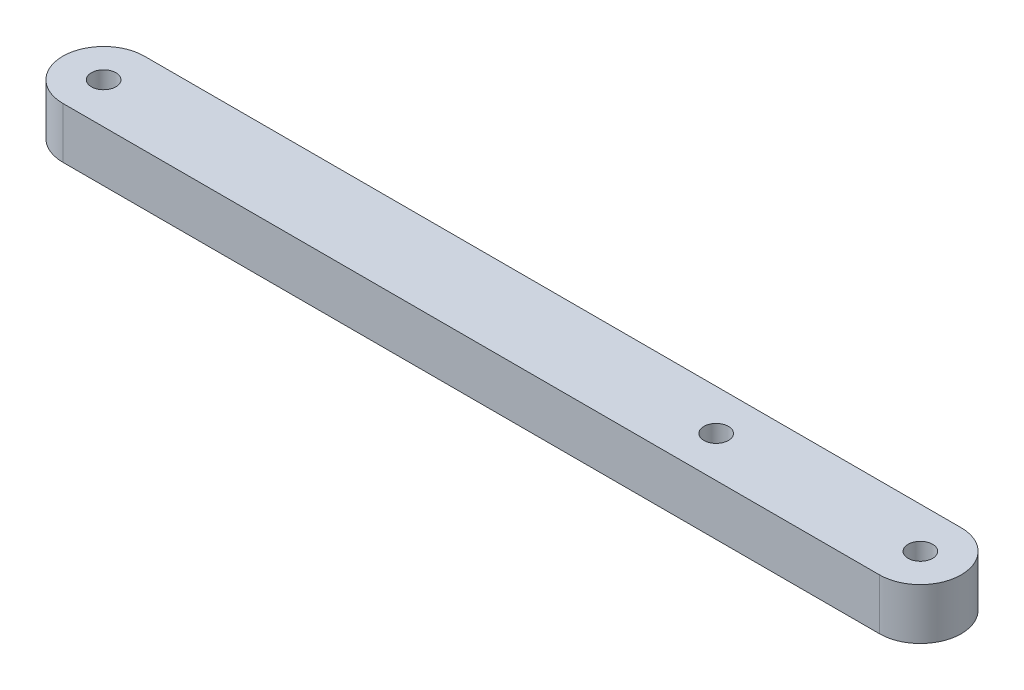
ISO-10303-21;
HEADER;
FILE_DESCRIPTION(('STEP AP214'),'2;1');
FILE_NAME('part.step','',(''),(''),'','','');
FILE_SCHEMA(('AUTOMOTIVE_DESIGN { 1 0 10303 214 1 1 1 1 }'));
ENDSEC;
DATA;
#1=APPLICATION_CONTEXT('core data for automotive mechanical design processes');
#2=APPLICATION_PROTOCOL_DEFINITION('international standard','automotive_design',2000,#1);
#3=PRODUCT_CONTEXT('',#1,'mechanical');
#4=PRODUCT('Part','Part','',(#3));
#5=PRODUCT_RELATED_PRODUCT_CATEGORY('part','',(#4));
#6=PRODUCT_DEFINITION_FORMATION('','',#4);
#7=PRODUCT_DEFINITION_CONTEXT('part definition',#1,'design');
#8=PRODUCT_DEFINITION('design','',#6,#7);
#9=PRODUCT_DEFINITION_SHAPE('','',#8);
#10=(LENGTH_UNIT() NAMED_UNIT(*) SI_UNIT(.MILLI.,.METRE.));
#11=(NAMED_UNIT(*) PLANE_ANGLE_UNIT() SI_UNIT($,.RADIAN.));
#12=(NAMED_UNIT(*) SI_UNIT($,.STERADIAN.) SOLID_ANGLE_UNIT());
#13=UNCERTAINTY_MEASURE_WITH_UNIT(LENGTH_MEASURE(1.E-05),#10,'distance_accuracy_value','');
#14=(GEOMETRIC_REPRESENTATION_CONTEXT(3) GLOBAL_UNCERTAINTY_ASSIGNED_CONTEXT((#13)) GLOBAL_UNIT_ASSIGNED_CONTEXT((#10,
#11,#12)) REPRESENTATION_CONTEXT('',''));
#15=CARTESIAN_POINT('',(0.,0.,0.));
#16=DIRECTION('',(0.,0.,1.));
#17=DIRECTION('',(1.,0.,0.));
#18=AXIS2_PLACEMENT_3D('',#15,#16,#17);
#19=CARTESIAN_POINT('',(0.,25.,0.));
#20=DIRECTION('',(0.,1.,0.));
#21=DIRECTION('',(0.,0.,1.));
#22=AXIS2_PLACEMENT_3D('',#19,#20,#21);
#23=PLANE('',#22);
#24=CARTESIAN_POINT('',(400.,25.,0.));
#25=DIRECTION('',(0.,1.,0.));
#26=DIRECTION('',(0.,0.,1.));
#27=AXIS2_PLACEMENT_3D('',#24,#25,#26);
#28=CIRCLE('',#27,5.99999999999999);
#29=CARTESIAN_POINT('',(400.,25.,5.99999999999999));
#30=VERTEX_POINT('',#29);
#31=EDGE_CURVE('E115',#30,#30,#28,.T.);
#32=ORIENTED_EDGE('',*,*,#31,.F.);
#33=EDGE_LOOP('',(#32));
#34=FACE_BOUND('',#33,.T.);
#35=CARTESIAN_POINT('',(0.,25.,0.));
#36=DIRECTION('',(0.,1.,0.));
#37=DIRECTION('',(0.,0.,1.));
#38=AXIS2_PLACEMENT_3D('',#35,#36,#37);
#39=CIRCLE('',#38,20.);
#40=CARTESIAN_POINT('',(0.,25.,-20.));
#41=VERTEX_POINT('',#40);
#42=CARTESIAN_POINT('',(0.,25.,20.));
#43=VERTEX_POINT('',#42);
#44=EDGE_CURVE('E85',#41,#43,#39,.T.);
#45=ORIENTED_EDGE('',*,*,#44,.T.);
#46=DIRECTION('',(1.,0.,0.));
#47=VECTOR('',#46,1.);
#48=CARTESIAN_POINT('',(0.,25.,20.));
#49=LINE('',#48,#47);
#50=CARTESIAN_POINT('',(400.,25.,20.));
#51=VERTEX_POINT('',#50);
#52=EDGE_CURVE('E80',#43,#51,#49,.T.);
#53=ORIENTED_EDGE('',*,*,#52,.T.);
#54=CARTESIAN_POINT('',(400.,25.,0.));
#55=DIRECTION('',(0.,1.,0.));
#56=DIRECTION('',(0.,0.,1.));
#57=AXIS2_PLACEMENT_3D('',#54,#55,#56);
#58=CIRCLE('',#57,20.);
#59=CARTESIAN_POINT('',(400.,25.,-20.));
#60=VERTEX_POINT('',#59);
#61=EDGE_CURVE('E83',#51,#60,#58,.T.);
#62=ORIENTED_EDGE('',*,*,#61,.T.);
#63=DIRECTION('',(-1.,0.,0.));
#64=VECTOR('',#63,1.);
#65=CARTESIAN_POINT('',(0.,25.,-20.));
#66=LINE('',#65,#64);
#67=EDGE_CURVE('E50',#60,#41,#66,.T.);
#68=ORIENTED_EDGE('',*,*,#67,.T.);
#69=EDGE_LOOP('',(#45,#53,#62,#68));
#70=FACE_BOUND('',#69,.T.);
#71=CARTESIAN_POINT('',(300.,25.,0.));
#72=DIRECTION('',(0.,1.,0.));
#73=DIRECTION('',(0.,0.,1.));
#74=AXIS2_PLACEMENT_3D('',#71,#72,#73);
#75=CIRCLE('',#74,5.99999999999999);
#76=CARTESIAN_POINT('',(300.,25.,5.99999999999999));
#77=VERTEX_POINT('',#76);
#78=EDGE_CURVE('E100',#77,#77,#75,.T.);
#79=ORIENTED_EDGE('',*,*,#78,.F.);
#80=EDGE_LOOP('',(#79));
#81=FACE_BOUND('',#80,.T.);
#82=CARTESIAN_POINT('',(0.,25.,0.));
#83=DIRECTION('',(0.,1.,0.));
#84=DIRECTION('',(0.,0.,1.));
#85=AXIS2_PLACEMENT_3D('',#82,#83,#84);
#86=CIRCLE('',#85,6.);
#87=CARTESIAN_POINT('',(0.,25.,6.));
#88=VERTEX_POINT('',#87);
#89=EDGE_CURVE('E121',#88,#88,#86,.T.);
#90=ORIENTED_EDGE('',*,*,#89,.F.);
#91=EDGE_LOOP('',(#90));
#92=FACE_BOUND('',#91,.T.);
#93=ADVANCED_FACE('F33',(#34,#70,#81,#92),#23,.T.);
#94=CARTESIAN_POINT('',(0.,0.,0.));
#95=DIRECTION('',(0.,1.,0.));
#96=DIRECTION('',(0.,0.,1.));
#97=AXIS2_PLACEMENT_3D('',#94,#95,#96);
#98=PLANE('',#97);
#99=CARTESIAN_POINT('',(0.,0.,0.));
#100=DIRECTION('',(0.,1.,0.));
#101=DIRECTION('',(0.,0.,1.));
#102=AXIS2_PLACEMENT_3D('',#99,#100,#101);
#103=CIRCLE('',#102,20.);
#104=CARTESIAN_POINT('',(0.,0.,-20.));
#105=VERTEX_POINT('',#104);
#106=CARTESIAN_POINT('',(0.,0.,20.));
#107=VERTEX_POINT('',#106);
#108=EDGE_CURVE('E97',#105,#107,#103,.T.);
#109=ORIENTED_EDGE('',*,*,#108,.F.);
#110=DIRECTION('',(-1.,0.,0.));
#111=VECTOR('',#110,1.);
#112=CARTESIAN_POINT('',(0.,0.,-20.));
#113=LINE('',#112,#111);
#114=CARTESIAN_POINT('',(400.,0.,-20.));
#115=VERTEX_POINT('',#114);
#116=EDGE_CURVE('E73',#115,#105,#113,.T.);
#117=ORIENTED_EDGE('',*,*,#116,.F.);
#118=CARTESIAN_POINT('',(400.,0.,0.));
#119=DIRECTION('',(0.,1.,0.));
#120=DIRECTION('',(0.,0.,1.));
#121=AXIS2_PLACEMENT_3D('',#118,#119,#120);
#122=CIRCLE('',#121,20.);
#123=CARTESIAN_POINT('',(400.,0.,20.));
#124=VERTEX_POINT('',#123);
#125=EDGE_CURVE('E67',#124,#115,#122,.T.);
#126=ORIENTED_EDGE('',*,*,#125,.F.);
#127=DIRECTION('',(1.,0.,0.));
#128=VECTOR('',#127,1.);
#129=CARTESIAN_POINT('',(0.,0.,20.));
#130=LINE('',#129,#128);
#131=EDGE_CURVE('E89',#107,#124,#130,.T.);
#132=ORIENTED_EDGE('',*,*,#131,.F.);
#133=EDGE_LOOP('',(#109,#117,#126,#132));
#134=FACE_BOUND('',#133,.T.);
#135=CARTESIAN_POINT('',(300.,0.,0.));
#136=DIRECTION('',(0.,1.,0.));
#137=DIRECTION('',(0.,0.,1.));
#138=AXIS2_PLACEMENT_3D('',#135,#136,#137);
#139=CIRCLE('',#138,5.99999999999999);
#140=CARTESIAN_POINT('',(300.,0.,5.99999999999999));
#141=VERTEX_POINT('',#140);
#142=EDGE_CURVE('E112',#141,#141,#139,.T.);
#143=ORIENTED_EDGE('',*,*,#142,.T.);
#144=EDGE_LOOP('',(#143));
#145=FACE_BOUND('',#144,.T.);
#146=CARTESIAN_POINT('',(400.,0.,0.));
#147=DIRECTION('',(0.,1.,0.));
#148=DIRECTION('',(0.,0.,1.));
#149=AXIS2_PLACEMENT_3D('',#146,#147,#148);
#150=CIRCLE('',#149,5.99999999999999);
#151=CARTESIAN_POINT('',(400.,0.,5.99999999999999));
#152=VERTEX_POINT('',#151);
#153=EDGE_CURVE('E118',#152,#152,#150,.T.);
#154=ORIENTED_EDGE('',*,*,#153,.T.);
#155=EDGE_LOOP('',(#154));
#156=FACE_BOUND('',#155,.T.);
#157=CARTESIAN_POINT('',(0.,0.,0.));
#158=DIRECTION('',(0.,1.,0.));
#159=DIRECTION('',(0.,0.,1.));
#160=AXIS2_PLACEMENT_3D('',#157,#158,#159);
#161=CIRCLE('',#160,6.);
#162=CARTESIAN_POINT('',(0.,0.,6.));
#163=VERTEX_POINT('',#162);
#164=EDGE_CURVE('E124',#163,#163,#161,.T.);
#165=ORIENTED_EDGE('',*,*,#164,.T.);
#166=EDGE_LOOP('',(#165));
#167=FACE_BOUND('',#166,.T.);
#168=ADVANCED_FACE('F108',(#134,#145,#156,#167),#98,.F.);
#169=CARTESIAN_POINT('',(0.,25.,0.));
#170=DIRECTION('',(0.,-1.,0.));
#171=DIRECTION('',(0.,0.,-1.));
#172=AXIS2_PLACEMENT_3D('',#169,#170,#171);
#173=CYLINDRICAL_SURFACE('',#172,20.);
#174=ORIENTED_EDGE('',*,*,#108,.T.);
#175=DIRECTION('',(0.,-1.,0.));
#176=VECTOR('',#175,1.);
#177=CARTESIAN_POINT('',(0.,25.,20.));
#178=LINE('',#177,#176);
#179=EDGE_CURVE('E11',#43,#107,#178,.T.);
#180=ORIENTED_EDGE('',*,*,#179,.F.);
#181=ORIENTED_EDGE('',*,*,#44,.F.);
#182=DIRECTION('',(0.,-1.,0.));
#183=VECTOR('',#182,1.);
#184=CARTESIAN_POINT('',(0.,25.,-20.));
#185=LINE('',#184,#183);
#186=EDGE_CURVE('E93',#41,#105,#185,.T.);
#187=ORIENTED_EDGE('',*,*,#186,.T.);
#188=EDGE_LOOP('',(#174,#180,#181,#187));
#189=FACE_BOUND('',#188,.T.);
#190=ADVANCED_FACE('F35',(#189),#173,.T.);
#191=CARTESIAN_POINT('',(0.,25.,20.));
#192=DIRECTION('',(0.,0.,-1.));
#193=DIRECTION('',(-1.,0.,0.));
#194=AXIS2_PLACEMENT_3D('',#191,#192,#193);
#195=PLANE('',#194);
#196=ORIENTED_EDGE('',*,*,#131,.T.);
#197=DIRECTION('',(0.,-1.,0.));
#198=VECTOR('',#197,1.);
#199=CARTESIAN_POINT('',(400.,25.,20.));
#200=LINE('',#199,#198);
#201=EDGE_CURVE('E42',#51,#124,#200,.T.);
#202=ORIENTED_EDGE('',*,*,#201,.F.);
#203=ORIENTED_EDGE('',*,*,#52,.F.);
#204=ORIENTED_EDGE('',*,*,#179,.T.);
#205=EDGE_LOOP('',(#196,#202,#203,#204));
#206=FACE_BOUND('',#205,.T.);
#207=ADVANCED_FACE('F88',(#206),#195,.F.);
#208=CARTESIAN_POINT('',(400.,25.,0.));
#209=DIRECTION('',(0.,-1.,0.));
#210=DIRECTION('',(0.,0.,-1.));
#211=AXIS2_PLACEMENT_3D('',#208,#209,#210);
#212=CYLINDRICAL_SURFACE('',#211,20.);
#213=ORIENTED_EDGE('',*,*,#125,.T.);
#214=DIRECTION('',(0.,-1.,0.));
#215=VECTOR('',#214,1.);
#216=CARTESIAN_POINT('',(400.,25.,-20.));
#217=LINE('',#216,#215);
#218=EDGE_CURVE('E90',#60,#115,#217,.T.);
#219=ORIENTED_EDGE('',*,*,#218,.F.);
#220=ORIENTED_EDGE('',*,*,#61,.F.);
#221=ORIENTED_EDGE('',*,*,#201,.T.);
#222=EDGE_LOOP('',(#213,#219,#220,#221));
#223=FACE_BOUND('',#222,.T.);
#224=ADVANCED_FACE('F91',(#223),#212,.T.);
#225=CARTESIAN_POINT('',(0.,25.,-20.));
#226=DIRECTION('',(0.,0.,1.));
#227=DIRECTION('',(1.,0.,0.));
#228=AXIS2_PLACEMENT_3D('',#225,#226,#227);
#229=PLANE('',#228);
#230=ORIENTED_EDGE('',*,*,#116,.T.);
#231=ORIENTED_EDGE('',*,*,#186,.F.);
#232=ORIENTED_EDGE('',*,*,#67,.F.);
#233=ORIENTED_EDGE('',*,*,#218,.T.);
#234=EDGE_LOOP('',(#230,#231,#232,#233));
#235=FACE_BOUND('',#234,.T.);
#236=ADVANCED_FACE('F105',(#235),#229,.F.);
#237=CARTESIAN_POINT('',(300.,25.,0.));
#238=DIRECTION('',(0.,-1.,0.));
#239=DIRECTION('',(0.,0.,-1.));
#240=AXIS2_PLACEMENT_3D('',#237,#238,#239);
#241=CYLINDRICAL_SURFACE('',#240,5.99999999999999);
#242=ORIENTED_EDGE('',*,*,#78,.T.);
#243=EDGE_LOOP('',(#242));
#244=FACE_BOUND('',#243,.T.);
#245=ORIENTED_EDGE('',*,*,#142,.F.);
#246=EDGE_LOOP('',(#245));
#247=FACE_BOUND('',#246,.T.);
#248=ADVANCED_FACE('F142',(#244,#247),#241,.F.);
#249=CARTESIAN_POINT('',(400.,25.,0.));
#250=DIRECTION('',(0.,-1.,0.));
#251=DIRECTION('',(0.,0.,-1.));
#252=AXIS2_PLACEMENT_3D('',#249,#250,#251);
#253=CYLINDRICAL_SURFACE('',#252,5.99999999999999);
#254=ORIENTED_EDGE('',*,*,#31,.T.);
#255=EDGE_LOOP('',(#254));
#256=FACE_BOUND('',#255,.T.);
#257=ORIENTED_EDGE('',*,*,#153,.F.);
#258=EDGE_LOOP('',(#257));
#259=FACE_BOUND('',#258,.T.);
#260=ADVANCED_FACE('F188',(#256,#259),#253,.F.);
#261=CARTESIAN_POINT('',(0.,25.,0.));
#262=DIRECTION('',(0.,-1.,0.));
#263=DIRECTION('',(0.,0.,-1.));
#264=AXIS2_PLACEMENT_3D('',#261,#262,#263);
#265=CYLINDRICAL_SURFACE('',#264,6.);
#266=ORIENTED_EDGE('',*,*,#89,.T.);
#267=EDGE_LOOP('',(#266));
#268=FACE_BOUND('',#267,.T.);
#269=ORIENTED_EDGE('',*,*,#164,.F.);
#270=EDGE_LOOP('',(#269));
#271=FACE_BOUND('',#270,.T.);
#272=ADVANCED_FACE('F130',(#268,#271),#265,.F.);
#273=CLOSED_SHELL('',(#93,#168,#190,#207,#224,#236,#248,#260,#272));
#274=MANIFOLD_SOLID_BREP('B2',#273);
#275=ADVANCED_BREP_SHAPE_REPRESENTATION('',(#18,#274),#14);
#276=SHAPE_DEFINITION_REPRESENTATION(#9,#275);
ENDSEC;
END-ISO-10303-21;
